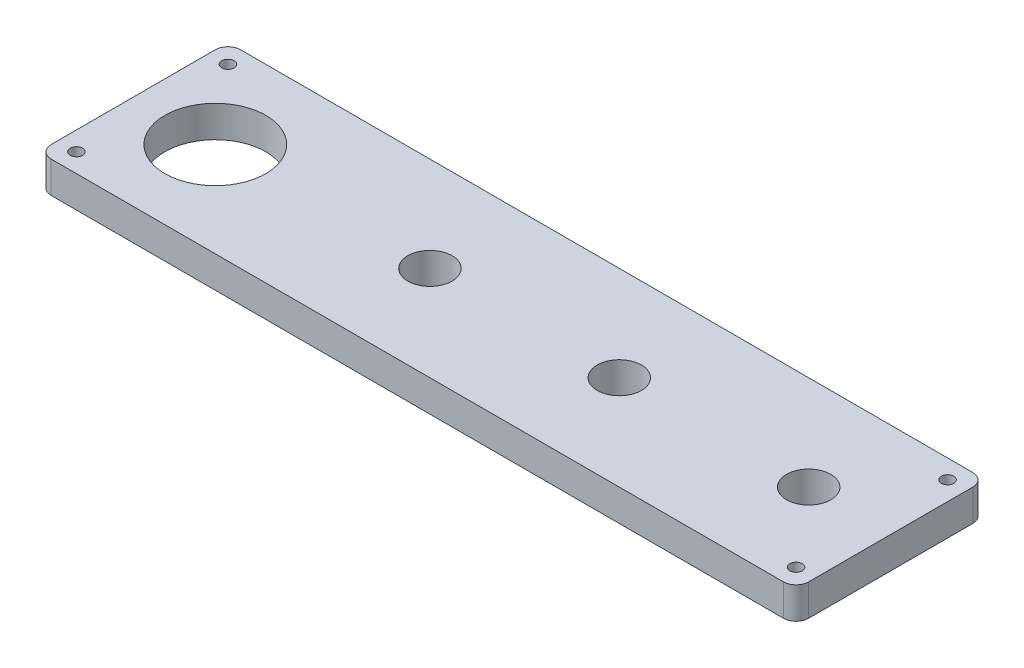
ISO-10303-21;
HEADER;
FILE_DESCRIPTION(('STEP AP214'),'2;1');
FILE_NAME('part.step','',(''),(''),'','','');
FILE_SCHEMA(('AUTOMOTIVE_DESIGN { 1 0 10303 214 1 1 1 1 }'));
ENDSEC;
DATA;
#1=APPLICATION_CONTEXT('core data for automotive mechanical design processes');
#2=APPLICATION_PROTOCOL_DEFINITION('international standard','automotive_design',2000,#1);
#3=PRODUCT_CONTEXT('',#1,'mechanical');
#4=PRODUCT('Part','Part','',(#3));
#5=PRODUCT_RELATED_PRODUCT_CATEGORY('part','',(#4));
#6=PRODUCT_DEFINITION_FORMATION('','',#4);
#7=PRODUCT_DEFINITION_CONTEXT('part definition',#1,'design');
#8=PRODUCT_DEFINITION('design','',#6,#7);
#9=PRODUCT_DEFINITION_SHAPE('','',#8);
#10=(LENGTH_UNIT() NAMED_UNIT(*) SI_UNIT(.MILLI.,.METRE.));
#11=(NAMED_UNIT(*) PLANE_ANGLE_UNIT() SI_UNIT($,.RADIAN.));
#12=(NAMED_UNIT(*) SI_UNIT($,.STERADIAN.) SOLID_ANGLE_UNIT());
#13=UNCERTAINTY_MEASURE_WITH_UNIT(LENGTH_MEASURE(1.E-05),#10,'distance_accuracy_value','');
#14=(GEOMETRIC_REPRESENTATION_CONTEXT(3) GLOBAL_UNCERTAINTY_ASSIGNED_CONTEXT((#13)) GLOBAL_UNIT_ASSIGNED_CONTEXT((#10,
#11,#12)) REPRESENTATION_CONTEXT('',''));
#15=CARTESIAN_POINT('',(0.,0.,0.));
#16=DIRECTION('',(0.,0.,1.));
#17=DIRECTION('',(1.,0.,0.));
#18=AXIS2_PLACEMENT_3D('',#15,#16,#17);
#19=CARTESIAN_POINT('',(-35.56,6.35,-16.51));
#20=DIRECTION('',(0.,-1.,0.));
#21=DIRECTION('',(0.,0.,-1.));
#22=AXIS2_PLACEMENT_3D('',#19,#20,#21);
#23=CYLINDRICAL_SURFACE('',#22,2.54);
#24=CARTESIAN_POINT('',(-35.56,0.,-16.51));
#25=DIRECTION('',(0.,-1.,0.));
#26=DIRECTION('',(0.,0.,-1.));
#27=AXIS2_PLACEMENT_3D('',#24,#25,#26);
#28=CIRCLE('',#27,2.54);
#29=CARTESIAN_POINT('',(-38.1,0.,-16.51));
#30=VERTEX_POINT('',#29);
#31=CARTESIAN_POINT('',(-35.56,0.,-19.05));
#32=VERTEX_POINT('',#31);
#33=EDGE_CURVE('E134',#30,#32,#28,.T.);
#34=ORIENTED_EDGE('',*,*,#33,.F.);
#35=DIRECTION('',(0.,-1.,0.));
#36=VECTOR('',#35,1.);
#37=CARTESIAN_POINT('',(-38.1,6.35,-16.51));
#38=LINE('',#37,#36);
#39=CARTESIAN_POINT('',(-38.1,6.35,-16.51));
#40=VERTEX_POINT('',#39);
#41=EDGE_CURVE('E11',#40,#30,#38,.T.);
#42=ORIENTED_EDGE('',*,*,#41,.F.);
#43=CARTESIAN_POINT('',(-35.56,6.35,-16.51));
#44=DIRECTION('',(0.,-1.,0.));
#45=DIRECTION('',(0.,0.,-1.));
#46=AXIS2_PLACEMENT_3D('',#43,#44,#45);
#47=CIRCLE('',#46,2.54);
#48=CARTESIAN_POINT('',(-35.56,6.35,-19.05));
#49=VERTEX_POINT('',#48);
#50=EDGE_CURVE('E155',#40,#49,#47,.T.);
#51=ORIENTED_EDGE('',*,*,#50,.T.);
#52=DIRECTION('',(0.,-1.,0.));
#53=VECTOR('',#52,1.);
#54=CARTESIAN_POINT('',(-35.56,6.35,-19.05));
#55=LINE('',#54,#53);
#56=EDGE_CURVE('E40',#49,#32,#55,.T.);
#57=ORIENTED_EDGE('',*,*,#56,.T.);
#58=EDGE_LOOP('',(#34,#42,#51,#57));
#59=FACE_BOUND('',#58,.T.);
#60=ADVANCED_FACE('F37',(#59),#23,.T.);
#61=CARTESIAN_POINT('',(-38.1,6.35,16.51));
#62=DIRECTION('',(-1.,0.,0.));
#63=DIRECTION('',(0.,0.,1.));
#64=AXIS2_PLACEMENT_3D('',#61,#62,#63);
#65=PLANE('',#64);
#66=DIRECTION('',(0.,0.,-1.));
#67=VECTOR('',#66,1.);
#68=CARTESIAN_POINT('',(-38.1,0.,16.51));
#69=LINE('',#68,#67);
#70=CARTESIAN_POINT('',(-38.1,0.,16.51));
#71=VERTEX_POINT('',#70);
#72=EDGE_CURVE('E153',#71,#30,#69,.T.);
#73=ORIENTED_EDGE('',*,*,#72,.F.);
#74=DIRECTION('',(0.,-1.,0.));
#75=VECTOR('',#74,1.);
#76=CARTESIAN_POINT('',(-38.1,6.35,16.51));
#77=LINE('',#76,#75);
#78=CARTESIAN_POINT('',(-38.1,6.35,16.51));
#79=VERTEX_POINT('',#78);
#80=EDGE_CURVE('E46',#79,#71,#77,.T.);
#81=ORIENTED_EDGE('',*,*,#80,.F.);
#82=DIRECTION('',(0.,0.,-1.));
#83=VECTOR('',#82,1.);
#84=CARTESIAN_POINT('',(-38.1,6.35,16.51));
#85=LINE('',#84,#83);
#86=EDGE_CURVE('E124',#79,#40,#85,.T.);
#87=ORIENTED_EDGE('',*,*,#86,.T.);
#88=ORIENTED_EDGE('',*,*,#41,.T.);
#89=EDGE_LOOP('',(#73,#81,#87,#88));
#90=FACE_BOUND('',#89,.T.);
#91=ADVANCED_FACE('F167',(#90),#65,.T.);
#92=CARTESIAN_POINT('',(-35.56,6.35,16.51));
#93=DIRECTION('',(0.,-1.,0.));
#94=DIRECTION('',(0.,0.,-1.));
#95=AXIS2_PLACEMENT_3D('',#92,#93,#94);
#96=CYLINDRICAL_SURFACE('',#95,2.54);
#97=CARTESIAN_POINT('',(-35.56,0.,16.51));
#98=DIRECTION('',(0.,-1.,0.));
#99=DIRECTION('',(0.,0.,-1.));
#100=AXIS2_PLACEMENT_3D('',#97,#98,#99);
#101=CIRCLE('',#100,2.54);
#102=CARTESIAN_POINT('',(-35.56,0.,19.05));
#103=VERTEX_POINT('',#102);
#104=EDGE_CURVE('E111',#103,#71,#101,.T.);
#105=ORIENTED_EDGE('',*,*,#104,.F.);
#106=DIRECTION('',(0.,-1.,0.));
#107=VECTOR('',#106,1.);
#108=CARTESIAN_POINT('',(-35.56,6.35,19.05));
#109=LINE('',#108,#107);
#110=CARTESIAN_POINT('',(-35.56,6.35,19.05));
#111=VERTEX_POINT('',#110);
#112=EDGE_CURVE('E106',#111,#103,#109,.T.);
#113=ORIENTED_EDGE('',*,*,#112,.F.);
#114=CARTESIAN_POINT('',(-35.56,6.35,16.51));
#115=DIRECTION('',(0.,-1.,0.));
#116=DIRECTION('',(0.,0.,-1.));
#117=AXIS2_PLACEMENT_3D('',#114,#115,#116);
#118=CIRCLE('',#117,2.54);
#119=EDGE_CURVE('E109',#111,#79,#118,.T.);
#120=ORIENTED_EDGE('',*,*,#119,.T.);
#121=ORIENTED_EDGE('',*,*,#80,.T.);
#122=EDGE_LOOP('',(#105,#113,#120,#121));
#123=FACE_BOUND('',#122,.T.);
#124=ADVANCED_FACE('F108',(#123),#96,.T.);
#125=CARTESIAN_POINT('',(111.76,6.35,19.05));
#126=DIRECTION('',(0.,0.,1.));
#127=DIRECTION('',(1.,0.,0.));
#128=AXIS2_PLACEMENT_3D('',#125,#126,#127);
#129=PLANE('',#128);
#130=DIRECTION('',(-1.,0.,0.));
#131=VECTOR('',#130,1.);
#132=CARTESIAN_POINT('',(111.76,0.,19.05));
#133=LINE('',#132,#131);
#134=CARTESIAN_POINT('',(111.76,0.,19.05));
#135=VERTEX_POINT('',#134);
#136=EDGE_CURVE('E150',#135,#103,#133,.T.);
#137=ORIENTED_EDGE('',*,*,#136,.F.);
#138=DIRECTION('',(0.,-1.,0.));
#139=VECTOR('',#138,1.);
#140=CARTESIAN_POINT('',(111.76,6.35,19.05));
#141=LINE('',#140,#139);
#142=CARTESIAN_POINT('',(111.76,6.35,19.05));
#143=VERTEX_POINT('',#142);
#144=EDGE_CURVE('E116',#143,#135,#141,.T.);
#145=ORIENTED_EDGE('',*,*,#144,.F.);
#146=DIRECTION('',(-1.,0.,0.));
#147=VECTOR('',#146,1.);
#148=CARTESIAN_POINT('',(111.76,6.35,19.05));
#149=LINE('',#148,#147);
#150=EDGE_CURVE('E122',#143,#111,#149,.T.);
#151=ORIENTED_EDGE('',*,*,#150,.T.);
#152=ORIENTED_EDGE('',*,*,#112,.T.);
#153=EDGE_LOOP('',(#137,#145,#151,#152));
#154=FACE_BOUND('',#153,.T.);
#155=ADVANCED_FACE('F126',(#154),#129,.T.);
#156=CARTESIAN_POINT('',(111.76,6.35,16.51));
#157=DIRECTION('',(0.,-1.,0.));
#158=DIRECTION('',(0.,0.,-1.));
#159=AXIS2_PLACEMENT_3D('',#156,#157,#158);
#160=CYLINDRICAL_SURFACE('',#159,2.54);
#161=CARTESIAN_POINT('',(111.76,0.,16.51));
#162=DIRECTION('',(0.,-1.,0.));
#163=DIRECTION('',(0.,0.,-1.));
#164=AXIS2_PLACEMENT_3D('',#161,#162,#163);
#165=CIRCLE('',#164,2.54);
#166=CARTESIAN_POINT('',(114.3,0.,16.51));
#167=VERTEX_POINT('',#166);
#168=EDGE_CURVE('E147',#167,#135,#165,.T.);
#169=ORIENTED_EDGE('',*,*,#168,.F.);
#170=DIRECTION('',(0.,-1.,0.));
#171=VECTOR('',#170,1.);
#172=CARTESIAN_POINT('',(114.3,6.35,16.51));
#173=LINE('',#172,#171);
#174=CARTESIAN_POINT('',(114.3,6.35,16.51));
#175=VERTEX_POINT('',#174);
#176=EDGE_CURVE('E159',#175,#167,#173,.T.);
#177=ORIENTED_EDGE('',*,*,#176,.F.);
#178=CARTESIAN_POINT('',(111.76,6.35,16.51));
#179=DIRECTION('',(0.,-1.,0.));
#180=DIRECTION('',(0.,0.,-1.));
#181=AXIS2_PLACEMENT_3D('',#178,#179,#180);
#182=CIRCLE('',#181,2.54);
#183=EDGE_CURVE('E127',#175,#143,#182,.T.);
#184=ORIENTED_EDGE('',*,*,#183,.T.);
#185=ORIENTED_EDGE('',*,*,#144,.T.);
#186=EDGE_LOOP('',(#169,#177,#184,#185));
#187=FACE_BOUND('',#186,.T.);
#188=ADVANCED_FACE('F180',(#187),#160,.T.);
#189=CARTESIAN_POINT('',(114.3,6.35,-16.51));
#190=DIRECTION('',(1.,0.,0.));
#191=DIRECTION('',(0.,0.,-1.));
#192=AXIS2_PLACEMENT_3D('',#189,#190,#191);
#193=PLANE('',#192);
#194=DIRECTION('',(0.,0.,1.));
#195=VECTOR('',#194,1.);
#196=CARTESIAN_POINT('',(114.3,0.,-16.51));
#197=LINE('',#196,#195);
#198=CARTESIAN_POINT('',(114.3,0.,-16.51));
#199=VERTEX_POINT('',#198);
#200=EDGE_CURVE('E144',#199,#167,#197,.T.);
#201=ORIENTED_EDGE('',*,*,#200,.F.);
#202=DIRECTION('',(0.,-1.,0.));
#203=VECTOR('',#202,1.);
#204=CARTESIAN_POINT('',(114.3,6.35,-16.51));
#205=LINE('',#204,#203);
#206=CARTESIAN_POINT('',(114.3,6.35,-16.51));
#207=VERTEX_POINT('',#206);
#208=EDGE_CURVE('E161',#207,#199,#205,.T.);
#209=ORIENTED_EDGE('',*,*,#208,.F.);
#210=DIRECTION('',(0.,0.,1.));
#211=VECTOR('',#210,1.);
#212=CARTESIAN_POINT('',(114.3,6.35,-16.51));
#213=LINE('',#212,#211);
#214=EDGE_CURVE('E129',#207,#175,#213,.T.);
#215=ORIENTED_EDGE('',*,*,#214,.T.);
#216=ORIENTED_EDGE('',*,*,#176,.T.);
#217=EDGE_LOOP('',(#201,#209,#215,#216));
#218=FACE_BOUND('',#217,.T.);
#219=ADVANCED_FACE('F183',(#218),#193,.T.);
#220=CARTESIAN_POINT('',(111.76,6.35,-16.51));
#221=DIRECTION('',(0.,-1.,0.));
#222=DIRECTION('',(0.,0.,-1.));
#223=AXIS2_PLACEMENT_3D('',#220,#221,#222);
#224=CYLINDRICAL_SURFACE('',#223,2.54);
#225=CARTESIAN_POINT('',(111.76,0.,-16.51));
#226=DIRECTION('',(0.,-1.,0.));
#227=DIRECTION('',(0.,0.,-1.));
#228=AXIS2_PLACEMENT_3D('',#225,#226,#227);
#229=CIRCLE('',#228,2.54);
#230=CARTESIAN_POINT('',(111.76,0.,-19.05));
#231=VERTEX_POINT('',#230);
#232=EDGE_CURVE('E141',#231,#199,#229,.T.);
#233=ORIENTED_EDGE('',*,*,#232,.F.);
#234=DIRECTION('',(0.,-1.,0.));
#235=VECTOR('',#234,1.);
#236=CARTESIAN_POINT('',(111.76,6.35,-19.05));
#237=LINE('',#236,#235);
#238=CARTESIAN_POINT('',(111.76,6.35,-19.05));
#239=VERTEX_POINT('',#238);
#240=EDGE_CURVE('E162',#239,#231,#237,.T.);
#241=ORIENTED_EDGE('',*,*,#240,.F.);
#242=CARTESIAN_POINT('',(111.76,6.35,-16.51));
#243=DIRECTION('',(0.,-1.,0.));
#244=DIRECTION('',(0.,0.,-1.));
#245=AXIS2_PLACEMENT_3D('',#242,#243,#244);
#246=CIRCLE('',#245,2.54);
#247=EDGE_CURVE('E289',#239,#207,#246,.T.);
#248=ORIENTED_EDGE('',*,*,#247,.T.);
#249=ORIENTED_EDGE('',*,*,#208,.T.);
#250=EDGE_LOOP('',(#233,#241,#248,#249));
#251=FACE_BOUND('',#250,.T.);
#252=ADVANCED_FACE('F187',(#251),#224,.T.);
#253=CARTESIAN_POINT('',(-35.56,6.35,-19.05));
#254=DIRECTION('',(0.,0.,-1.));
#255=DIRECTION('',(-1.,0.,0.));
#256=AXIS2_PLACEMENT_3D('',#253,#254,#255);
#257=PLANE('',#256);
#258=DIRECTION('',(1.,0.,0.));
#259=VECTOR('',#258,1.);
#260=CARTESIAN_POINT('',(-35.56,0.,-19.05));
#261=LINE('',#260,#259);
#262=EDGE_CURVE('E137',#32,#231,#261,.T.);
#263=ORIENTED_EDGE('',*,*,#262,.F.);
#264=ORIENTED_EDGE('',*,*,#56,.F.);
#265=DIRECTION('',(1.,0.,0.));
#266=VECTOR('',#265,1.);
#267=CARTESIAN_POINT('',(-35.56,6.35,-19.05));
#268=LINE('',#267,#266);
#269=EDGE_CURVE('E287',#49,#239,#268,.T.);
#270=ORIENTED_EDGE('',*,*,#269,.T.);
#271=ORIENTED_EDGE('',*,*,#240,.T.);
#272=EDGE_LOOP('',(#263,#264,#270,#271));
#273=FACE_BOUND('',#272,.T.);
#274=ADVANCED_FACE('F164',(#273),#257,.T.);
#275=CARTESIAN_POINT('',(-35.56,6.35,-16.51));
#276=DIRECTION('',(0.,-1.,0.));
#277=DIRECTION('',(0.,0.,-1.));
#278=AXIS2_PLACEMENT_3D('',#275,#276,#277);
#279=PLANE('',#278);
#280=CARTESIAN_POINT('',(-34.29,6.35,-15.24));
#281=DIRECTION('',(0.,1.,0.));
#282=DIRECTION('',(0.,0.,1.));
#283=AXIS2_PLACEMENT_3D('',#280,#281,#282);
#284=CIRCLE('',#283,1.24999999999999);
#285=CARTESIAN_POINT('',(-34.29,6.35,-13.99));
#286=VERTEX_POINT('',#285);
#287=EDGE_CURVE('E241',#286,#286,#284,.T.);
#288=ORIENTED_EDGE('',*,*,#287,.F.);
#289=EDGE_LOOP('',(#288));
#290=FACE_BOUND('',#289,.T.);
#291=CARTESIAN_POINT('',(110.49,6.35,-15.24));
#292=DIRECTION('',(0.,1.,0.));
#293=DIRECTION('',(0.,0.,1.));
#294=AXIS2_PLACEMENT_3D('',#291,#292,#293);
#295=CIRCLE('',#294,1.24999999999999);
#296=CARTESIAN_POINT('',(110.49,6.35,-13.99));
#297=VERTEX_POINT('',#296);
#298=EDGE_CURVE('E243',#297,#297,#295,.T.);
#299=ORIENTED_EDGE('',*,*,#298,.F.);
#300=EDGE_LOOP('',(#299));
#301=FACE_BOUND('',#300,.T.);
#302=CARTESIAN_POINT('',(110.49,6.35,15.24));
#303=DIRECTION('',(0.,1.,0.));
#304=DIRECTION('',(0.,0.,1.));
#305=AXIS2_PLACEMENT_3D('',#302,#303,#304);
#306=CIRCLE('',#305,1.24999999999999);
#307=CARTESIAN_POINT('',(110.49,6.35,16.49));
#308=VERTEX_POINT('',#307);
#309=EDGE_CURVE('E251',#308,#308,#306,.T.);
#310=ORIENTED_EDGE('',*,*,#309,.F.);
#311=EDGE_LOOP('',(#310));
#312=FACE_BOUND('',#311,.T.);
#313=CARTESIAN_POINT('',(-34.29,6.35,15.24));
#314=DIRECTION('',(0.,1.,0.));
#315=DIRECTION('',(0.,0.,1.));
#316=AXIS2_PLACEMENT_3D('',#313,#314,#315);
#317=CIRCLE('',#316,1.24999999999999);
#318=CARTESIAN_POINT('',(-34.29,6.35,16.49));
#319=VERTEX_POINT('',#318);
#320=EDGE_CURVE('E257',#319,#319,#317,.T.);
#321=ORIENTED_EDGE('',*,*,#320,.F.);
#322=EDGE_LOOP('',(#321));
#323=FACE_BOUND('',#322,.T.);
#324=CARTESIAN_POINT('',(-21.59,6.35,0.));
#325=DIRECTION('',(0.,-1.,0.));
#326=DIRECTION('',(0.,0.,1.));
#327=AXIS2_PLACEMENT_3D('',#324,#325,#326);
#328=CIRCLE('',#327,10.16);
#329=CARTESIAN_POINT('',(-21.59,6.35,10.16));
#330=VERTEX_POINT('',#329);
#331=EDGE_CURVE('E264',#330,#330,#328,.T.);
#332=ORIENTED_EDGE('',*,*,#331,.T.);
#333=EDGE_LOOP('',(#332));
#334=FACE_BOUND('',#333,.T.);
#335=CARTESIAN_POINT('',(21.59,6.35,0.));
#336=DIRECTION('',(0.,-1.,0.));
#337=DIRECTION('',(0.,0.,1.));
#338=AXIS2_PLACEMENT_3D('',#335,#336,#337);
#339=CIRCLE('',#338,4.445);
#340=CARTESIAN_POINT('',(21.59,6.35,4.445));
#341=VERTEX_POINT('',#340);
#342=EDGE_CURVE('E270',#341,#341,#339,.T.);
#343=ORIENTED_EDGE('',*,*,#342,.T.);
#344=EDGE_LOOP('',(#343));
#345=FACE_BOUND('',#344,.T.);
#346=CARTESIAN_POINT('',(97.79,6.35,0.));
#347=DIRECTION('',(0.,-1.,0.));
#348=DIRECTION('',(0.,0.,-1.));
#349=AXIS2_PLACEMENT_3D('',#346,#347,#348);
#350=CIRCLE('',#349,4.445);
#351=CARTESIAN_POINT('',(97.79,6.35,-4.445));
#352=VERTEX_POINT('',#351);
#353=EDGE_CURVE('E276',#352,#352,#350,.T.);
#354=ORIENTED_EDGE('',*,*,#353,.T.);
#355=EDGE_LOOP('',(#354));
#356=FACE_BOUND('',#355,.T.);
#357=CARTESIAN_POINT('',(59.69,6.35,0.));
#358=DIRECTION('',(0.,-1.,0.));
#359=DIRECTION('',(0.,0.,-1.));
#360=AXIS2_PLACEMENT_3D('',#357,#358,#359);
#361=CIRCLE('',#360,4.445);
#362=CARTESIAN_POINT('',(59.69,6.35,-4.445));
#363=VERTEX_POINT('',#362);
#364=EDGE_CURVE('E138',#363,#363,#361,.T.);
#365=ORIENTED_EDGE('',*,*,#364,.T.);
#366=EDGE_LOOP('',(#365));
#367=FACE_BOUND('',#366,.T.);
#368=ORIENTED_EDGE('',*,*,#50,.F.);
#369=ORIENTED_EDGE('',*,*,#86,.F.);
#370=ORIENTED_EDGE('',*,*,#119,.F.);
#371=ORIENTED_EDGE('',*,*,#150,.F.);
#372=ORIENTED_EDGE('',*,*,#183,.F.);
#373=ORIENTED_EDGE('',*,*,#214,.F.);
#374=ORIENTED_EDGE('',*,*,#247,.F.);
#375=ORIENTED_EDGE('',*,*,#269,.F.);
#376=EDGE_LOOP('',(#368,#369,#370,#371,#372,#373,#374,#375));
#377=FACE_BOUND('',#376,.T.);
#378=ADVANCED_FACE('F120',(#290,#301,#312,#323,#334,#345,#356,#367,#377),#279,.F.);
#379=CARTESIAN_POINT('',(-35.56,0.,-16.51));
#380=DIRECTION('',(0.,-1.,0.));
#381=DIRECTION('',(0.,0.,-1.));
#382=AXIS2_PLACEMENT_3D('',#379,#380,#381);
#383=PLANE('',#382);
#384=CARTESIAN_POINT('',(-34.29,0.,-15.24));
#385=DIRECTION('',(0.,1.,0.));
#386=DIRECTION('',(0.,0.,1.));
#387=AXIS2_PLACEMENT_3D('',#384,#385,#386);
#388=CIRCLE('',#387,1.25);
#389=CARTESIAN_POINT('',(-34.29,0.,-13.99));
#390=VERTEX_POINT('',#389);
#391=EDGE_CURVE('E239',#390,#390,#388,.T.);
#392=ORIENTED_EDGE('',*,*,#391,.T.);
#393=EDGE_LOOP('',(#392));
#394=FACE_BOUND('',#393,.T.);
#395=CARTESIAN_POINT('',(110.49,0.,-15.24));
#396=DIRECTION('',(0.,1.,0.));
#397=DIRECTION('',(0.,0.,1.));
#398=AXIS2_PLACEMENT_3D('',#395,#396,#397);
#399=CIRCLE('',#398,1.25);
#400=CARTESIAN_POINT('',(110.49,0.,-13.99));
#401=VERTEX_POINT('',#400);
#402=EDGE_CURVE('E248',#401,#401,#399,.T.);
#403=ORIENTED_EDGE('',*,*,#402,.T.);
#404=EDGE_LOOP('',(#403));
#405=FACE_BOUND('',#404,.T.);
#406=CARTESIAN_POINT('',(110.49,0.,15.24));
#407=DIRECTION('',(0.,1.,0.));
#408=DIRECTION('',(0.,0.,1.));
#409=AXIS2_PLACEMENT_3D('',#406,#407,#408);
#410=CIRCLE('',#409,1.25);
#411=CARTESIAN_POINT('',(110.49,0.,16.49));
#412=VERTEX_POINT('',#411);
#413=EDGE_CURVE('E254',#412,#412,#410,.T.);
#414=ORIENTED_EDGE('',*,*,#413,.T.);
#415=EDGE_LOOP('',(#414));
#416=FACE_BOUND('',#415,.T.);
#417=CARTESIAN_POINT('',(-34.29,0.,15.24));
#418=DIRECTION('',(0.,1.,0.));
#419=DIRECTION('',(0.,0.,1.));
#420=AXIS2_PLACEMENT_3D('',#417,#418,#419);
#421=CIRCLE('',#420,1.25);
#422=CARTESIAN_POINT('',(-34.29,0.,16.49));
#423=VERTEX_POINT('',#422);
#424=EDGE_CURVE('E260',#423,#423,#421,.T.);
#425=ORIENTED_EDGE('',*,*,#424,.T.);
#426=EDGE_LOOP('',(#425));
#427=FACE_BOUND('',#426,.T.);
#428=CARTESIAN_POINT('',(-21.59,0.,0.));
#429=DIRECTION('',(0.,-1.,0.));
#430=DIRECTION('',(0.,0.,1.));
#431=AXIS2_PLACEMENT_3D('',#428,#429,#430);
#432=CIRCLE('',#431,10.16);
#433=CARTESIAN_POINT('',(-21.59,0.,10.16));
#434=VERTEX_POINT('',#433);
#435=EDGE_CURVE('E263',#434,#434,#432,.T.);
#436=ORIENTED_EDGE('',*,*,#435,.F.);
#437=EDGE_LOOP('',(#436));
#438=FACE_BOUND('',#437,.T.);
#439=CARTESIAN_POINT('',(21.59,0.,0.));
#440=DIRECTION('',(0.,-1.,0.));
#441=DIRECTION('',(0.,0.,1.));
#442=AXIS2_PLACEMENT_3D('',#439,#440,#441);
#443=CIRCLE('',#442,4.445);
#444=CARTESIAN_POINT('',(21.59,0.,4.445));
#445=VERTEX_POINT('',#444);
#446=EDGE_CURVE('E267',#445,#445,#443,.T.);
#447=ORIENTED_EDGE('',*,*,#446,.F.);
#448=EDGE_LOOP('',(#447));
#449=FACE_BOUND('',#448,.T.);
#450=CARTESIAN_POINT('',(97.79,0.,0.));
#451=DIRECTION('',(0.,-1.,0.));
#452=DIRECTION('',(0.,0.,-1.));
#453=AXIS2_PLACEMENT_3D('',#450,#451,#452);
#454=CIRCLE('',#453,4.445);
#455=CARTESIAN_POINT('',(97.79,0.,-4.445));
#456=VERTEX_POINT('',#455);
#457=EDGE_CURVE('E273',#456,#456,#454,.T.);
#458=ORIENTED_EDGE('',*,*,#457,.F.);
#459=EDGE_LOOP('',(#458));
#460=FACE_BOUND('',#459,.T.);
#461=CARTESIAN_POINT('',(59.69,0.,0.));
#462=DIRECTION('',(0.,-1.,0.));
#463=DIRECTION('',(0.,0.,-1.));
#464=AXIS2_PLACEMENT_3D('',#461,#462,#463);
#465=CIRCLE('',#464,4.445);
#466=CARTESIAN_POINT('',(59.69,0.,-4.445));
#467=VERTEX_POINT('',#466);
#468=EDGE_CURVE('E279',#467,#467,#465,.T.);
#469=ORIENTED_EDGE('',*,*,#468,.F.);
#470=EDGE_LOOP('',(#469));
#471=FACE_BOUND('',#470,.T.);
#472=ORIENTED_EDGE('',*,*,#33,.T.);
#473=ORIENTED_EDGE('',*,*,#262,.T.);
#474=ORIENTED_EDGE('',*,*,#232,.T.);
#475=ORIENTED_EDGE('',*,*,#200,.T.);
#476=ORIENTED_EDGE('',*,*,#168,.T.);
#477=ORIENTED_EDGE('',*,*,#136,.T.);
#478=ORIENTED_EDGE('',*,*,#104,.T.);
#479=ORIENTED_EDGE('',*,*,#72,.T.);
#480=EDGE_LOOP('',(#472,#473,#474,#475,#476,#477,#478,#479));
#481=FACE_BOUND('',#480,.T.);
#482=ADVANCED_FACE('F166',(#394,#405,#416,#427,#438,#449,#460,#471,#481),#383,.T.);
#483=CARTESIAN_POINT('',(59.69,6.35,0.));
#484=DIRECTION('',(0.,-1.,0.));
#485=DIRECTION('',(0.,0.,-1.));
#486=AXIS2_PLACEMENT_3D('',#483,#484,#485);
#487=CYLINDRICAL_SURFACE('',#486,4.445);
#488=ORIENTED_EDGE('',*,*,#364,.F.);
#489=EDGE_LOOP('',(#488));
#490=FACE_BOUND('',#489,.T.);
#491=ORIENTED_EDGE('',*,*,#468,.T.);
#492=EDGE_LOOP('',(#491));
#493=FACE_BOUND('',#492,.T.);
#494=ADVANCED_FACE('F199',(#490,#493),#487,.F.);
#495=CARTESIAN_POINT('',(97.79,6.35,0.));
#496=DIRECTION('',(0.,-1.,0.));
#497=DIRECTION('',(0.,0.,-1.));
#498=AXIS2_PLACEMENT_3D('',#495,#496,#497);
#499=CYLINDRICAL_SURFACE('',#498,4.445);
#500=ORIENTED_EDGE('',*,*,#353,.F.);
#501=EDGE_LOOP('',(#500));
#502=FACE_BOUND('',#501,.T.);
#503=ORIENTED_EDGE('',*,*,#457,.T.);
#504=EDGE_LOOP('',(#503));
#505=FACE_BOUND('',#504,.T.);
#506=ADVANCED_FACE('F206',(#502,#505),#499,.F.);
#507=CARTESIAN_POINT('',(21.59,6.35,0.));
#508=DIRECTION('',(0.,-1.,0.));
#509=DIRECTION('',(0.,0.,-1.));
#510=AXIS2_PLACEMENT_3D('',#507,#508,#509);
#511=CYLINDRICAL_SURFACE('',#510,4.445);
#512=ORIENTED_EDGE('',*,*,#342,.F.);
#513=EDGE_LOOP('',(#512));
#514=FACE_BOUND('',#513,.T.);
#515=ORIENTED_EDGE('',*,*,#446,.T.);
#516=EDGE_LOOP('',(#515));
#517=FACE_BOUND('',#516,.T.);
#518=ADVANCED_FACE('F210',(#514,#517),#511,.F.);
#519=CARTESIAN_POINT('',(-21.59,6.35,0.));
#520=DIRECTION('',(0.,-1.,0.));
#521=DIRECTION('',(0.,0.,-1.));
#522=AXIS2_PLACEMENT_3D('',#519,#520,#521);
#523=CYLINDRICAL_SURFACE('',#522,10.16);
#524=ORIENTED_EDGE('',*,*,#331,.F.);
#525=EDGE_LOOP('',(#524));
#526=FACE_BOUND('',#525,.T.);
#527=ORIENTED_EDGE('',*,*,#435,.T.);
#528=EDGE_LOOP('',(#527));
#529=FACE_BOUND('',#528,.T.);
#530=ADVANCED_FACE('F214',(#526,#529),#523,.F.);
#531=CARTESIAN_POINT('',(-34.29,6.35,15.24));
#532=DIRECTION('',(0.,1.,0.));
#533=DIRECTION('',(0.,0.,1.));
#534=AXIS2_PLACEMENT_3D('',#531,#532,#533);
#535=CYLINDRICAL_SURFACE('',#534,1.24999999999999);
#536=ORIENTED_EDGE('',*,*,#424,.F.);
#537=EDGE_LOOP('',(#536));
#538=FACE_BOUND('',#537,.T.);
#539=ORIENTED_EDGE('',*,*,#320,.T.);
#540=EDGE_LOOP('',(#539));
#541=FACE_BOUND('',#540,.T.);
#542=ADVANCED_FACE('F218',(#538,#541),#535,.F.);
#543=CARTESIAN_POINT('',(110.49,6.35,15.24));
#544=DIRECTION('',(0.,1.,0.));
#545=DIRECTION('',(0.,0.,1.));
#546=AXIS2_PLACEMENT_3D('',#543,#544,#545);
#547=CYLINDRICAL_SURFACE('',#546,1.24999999999999);
#548=ORIENTED_EDGE('',*,*,#413,.F.);
#549=EDGE_LOOP('',(#548));
#550=FACE_BOUND('',#549,.T.);
#551=ORIENTED_EDGE('',*,*,#309,.T.);
#552=EDGE_LOOP('',(#551));
#553=FACE_BOUND('',#552,.T.);
#554=ADVANCED_FACE('F222',(#550,#553),#547,.F.);
#555=CARTESIAN_POINT('',(110.49,6.35,-15.24));
#556=DIRECTION('',(0.,1.,0.));
#557=DIRECTION('',(0.,0.,1.));
#558=AXIS2_PLACEMENT_3D('',#555,#556,#557);
#559=CYLINDRICAL_SURFACE('',#558,1.24999999999999);
#560=ORIENTED_EDGE('',*,*,#402,.F.);
#561=EDGE_LOOP('',(#560));
#562=FACE_BOUND('',#561,.T.);
#563=ORIENTED_EDGE('',*,*,#298,.T.);
#564=EDGE_LOOP('',(#563));
#565=FACE_BOUND('',#564,.T.);
#566=ADVANCED_FACE('F226',(#562,#565),#559,.F.);
#567=CARTESIAN_POINT('',(-34.29,6.35,-15.24));
#568=DIRECTION('',(0.,1.,0.));
#569=DIRECTION('',(0.,0.,1.));
#570=AXIS2_PLACEMENT_3D('',#567,#568,#569);
#571=CYLINDRICAL_SURFACE('',#570,1.24999999999999);
#572=ORIENTED_EDGE('',*,*,#391,.F.);
#573=EDGE_LOOP('',(#572));
#574=FACE_BOUND('',#573,.T.);
#575=ORIENTED_EDGE('',*,*,#287,.T.);
#576=EDGE_LOOP('',(#575));
#577=FACE_BOUND('',#576,.T.);
#578=ADVANCED_FACE('F230',(#574,#577),#571,.F.);
#579=CLOSED_SHELL('',(#60,#91,#124,#155,#188,#219,#252,#274,#378,#482,#494,#506,#518,#530,#542,
#554,#566,#578));
#580=MANIFOLD_SOLID_BREP('B2',#579);
#581=ADVANCED_BREP_SHAPE_REPRESENTATION('',(#18,#580),#14);
#582=SHAPE_DEFINITION_REPRESENTATION(#9,#581);
ENDSEC;
END-ISO-10303-21;
